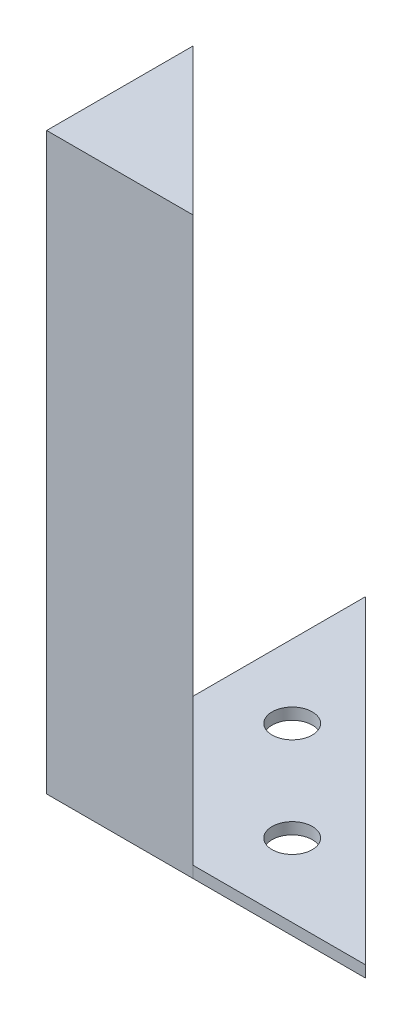
ISO-10303-21;
HEADER;
FILE_DESCRIPTION(('STEP AP214'),'2;1');
FILE_NAME('part.step','',(''),(''),'','','');
FILE_SCHEMA(('AUTOMOTIVE_DESIGN { 1 0 10303 214 1 1 1 1 }'));
ENDSEC;
DATA;
#1=APPLICATION_CONTEXT('core data for automotive mechanical design processes');
#2=APPLICATION_PROTOCOL_DEFINITION('international standard','automotive_design',2000,#1);
#3=PRODUCT_CONTEXT('',#1,'mechanical');
#4=PRODUCT('Part','Part','',(#3));
#5=PRODUCT_RELATED_PRODUCT_CATEGORY('part','',(#4));
#6=PRODUCT_DEFINITION_FORMATION('','',#4);
#7=PRODUCT_DEFINITION_CONTEXT('part definition',#1,'design');
#8=PRODUCT_DEFINITION('design','',#6,#7);
#9=PRODUCT_DEFINITION_SHAPE('','',#8);
#10=(LENGTH_UNIT() NAMED_UNIT(*) SI_UNIT(.MILLI.,.METRE.));
#11=(NAMED_UNIT(*) PLANE_ANGLE_UNIT() SI_UNIT($,.RADIAN.));
#12=(NAMED_UNIT(*) SI_UNIT($,.STERADIAN.) SOLID_ANGLE_UNIT());
#13=UNCERTAINTY_MEASURE_WITH_UNIT(LENGTH_MEASURE(1.E-05),#10,'distance_accuracy_value','');
#14=(GEOMETRIC_REPRESENTATION_CONTEXT(3) GLOBAL_UNCERTAINTY_ASSIGNED_CONTEXT((#13)) GLOBAL_UNIT_ASSIGNED_CONTEXT((#10,
#11,#12)) REPRESENTATION_CONTEXT('',''));
#15=CARTESIAN_POINT('',(0.,0.,0.));
#16=DIRECTION('',(0.,0.,1.));
#17=DIRECTION('',(1.,0.,0.));
#18=AXIS2_PLACEMENT_3D('',#15,#16,#17);
#19=CARTESIAN_POINT('',(12.7279220613579,1.,0.));
#20=DIRECTION('',(-0.707106781186547,0.,0.707106781186547));
#21=DIRECTION('',(0.707106781186548,0.,0.707106781186548));
#22=AXIS2_PLACEMENT_3D('',#19,#20,#21);
#23=PLANE('',#22);
#24=DIRECTION('',(-0.707106781186547,0.,-0.707106781186547));
#25=VECTOR('',#24,1.);
#26=CARTESIAN_POINT('',(12.7279220613579,0.,0.));
#27=LINE('',#26,#25);
#28=CARTESIAN_POINT('',(12.7279220613579,0.,0.));
#29=VERTEX_POINT('',#28);
#30=CARTESIAN_POINT('',(0.,0.,-12.7279220613579));
#31=VERTEX_POINT('',#30);
#32=EDGE_CURVE('E113',#29,#31,#27,.T.);
#33=ORIENTED_EDGE('',*,*,#32,.F.);
#34=DIRECTION('',(0.,-1.,0.));
#35=VECTOR('',#34,1.);
#36=CARTESIAN_POINT('',(12.7279220613579,1.,0.));
#37=LINE('',#36,#35);
#38=CARTESIAN_POINT('',(12.7279220613579,1.,0.));
#39=VERTEX_POINT('',#38);
#40=EDGE_CURVE('E12',#39,#29,#37,.T.);
#41=ORIENTED_EDGE('',*,*,#40,.F.);
#42=DIRECTION('',(-0.707106781186547,0.,-0.707106781186547));
#43=VECTOR('',#42,1.);
#44=CARTESIAN_POINT('',(12.7279220613579,1.,0.));
#45=LINE('',#44,#43);
#46=CARTESIAN_POINT('',(0.,1.,-12.7279220613579));
#47=VERTEX_POINT('',#46);
#48=EDGE_CURVE('E106',#39,#47,#45,.T.);
#49=ORIENTED_EDGE('',*,*,#48,.T.);
#50=DIRECTION('',(0.,-1.,0.));
#51=VECTOR('',#50,1.);
#52=CARTESIAN_POINT('',(0.,1.,-12.7279220613579));
#53=LINE('',#52,#51);
#54=EDGE_CURVE('E51',#47,#31,#53,.T.);
#55=ORIENTED_EDGE('',*,*,#54,.T.);
#56=EDGE_LOOP('',(#33,#41,#49,#55));
#57=FACE_BOUND('',#56,.T.);
#58=ADVANCED_FACE('F48',(#57),#23,.T.);
#59=CARTESIAN_POINT('',(27.7279220613579,1.,0.));
#60=DIRECTION('',(0.,0.,1.));
#61=DIRECTION('',(1.,0.,0.));
#62=AXIS2_PLACEMENT_3D('',#59,#60,#61);
#63=PLANE('',#62);
#64=DIRECTION('',(-1.,0.,0.));
#65=VECTOR('',#64,1.);
#66=CARTESIAN_POINT('',(27.7279220613579,0.,0.));
#67=LINE('',#66,#65);
#68=CARTESIAN_POINT('',(27.7279220613579,0.,0.));
#69=VERTEX_POINT('',#68);
#70=EDGE_CURVE('E108',#69,#29,#67,.T.);
#71=ORIENTED_EDGE('',*,*,#70,.F.);
#72=DIRECTION('',(0.,-1.,0.));
#73=VECTOR('',#72,1.);
#74=CARTESIAN_POINT('',(27.7279220613579,1.,0.));
#75=LINE('',#74,#73);
#76=CARTESIAN_POINT('',(27.7279220613579,1.,0.));
#77=VERTEX_POINT('',#76);
#78=EDGE_CURVE('E57',#77,#69,#75,.T.);
#79=ORIENTED_EDGE('',*,*,#78,.F.);
#80=DIRECTION('',(-1.,0.,0.));
#81=VECTOR('',#80,1.);
#82=CARTESIAN_POINT('',(27.7279220613579,1.,0.));
#83=LINE('',#82,#81);
#84=EDGE_CURVE('E103',#77,#39,#83,.T.);
#85=ORIENTED_EDGE('',*,*,#84,.T.);
#86=ORIENTED_EDGE('',*,*,#40,.T.);
#87=EDGE_LOOP('',(#71,#79,#85,#86));
#88=FACE_BOUND('',#87,.T.);
#89=ADVANCED_FACE('F124',(#88),#63,.T.);
#90=CARTESIAN_POINT('',(0.,1.,-27.7279220613579));
#91=DIRECTION('',(0.707106781186547,0.,-0.707106781186547));
#92=DIRECTION('',(-0.707106781186548,0.,-0.707106781186548));
#93=AXIS2_PLACEMENT_3D('',#90,#91,#92);
#94=PLANE('',#93);
#95=DIRECTION('',(0.707106781186547,0.,0.707106781186547));
#96=VECTOR('',#95,1.);
#97=CARTESIAN_POINT('',(0.,0.,-27.7279220613579));
#98=LINE('',#97,#96);
#99=CARTESIAN_POINT('',(0.,0.,-27.7279220613579));
#100=VERTEX_POINT('',#99);
#101=EDGE_CURVE('E98',#100,#69,#98,.T.);
#102=ORIENTED_EDGE('',*,*,#101,.F.);
#103=DIRECTION('',(0.,-1.,0.));
#104=VECTOR('',#103,1.);
#105=CARTESIAN_POINT('',(0.,1.,-27.7279220613579));
#106=LINE('',#105,#104);
#107=CARTESIAN_POINT('',(0.,1.,-27.7279220613579));
#108=VERTEX_POINT('',#107);
#109=EDGE_CURVE('E93',#108,#100,#106,.T.);
#110=ORIENTED_EDGE('',*,*,#109,.F.);
#111=DIRECTION('',(0.707106781186547,0.,0.707106781186547));
#112=VECTOR('',#111,1.);
#113=CARTESIAN_POINT('',(0.,1.,-27.7279220613579));
#114=LINE('',#113,#112);
#115=EDGE_CURVE('E96',#108,#77,#114,.T.);
#116=ORIENTED_EDGE('',*,*,#115,.T.);
#117=ORIENTED_EDGE('',*,*,#78,.T.);
#118=EDGE_LOOP('',(#102,#110,#116,#117));
#119=FACE_BOUND('',#118,.T.);
#120=ADVANCED_FACE('F95',(#119),#94,.T.);
#121=CARTESIAN_POINT('',(0.,1.,-12.7279220613579));
#122=DIRECTION('',(-1.,0.,0.));
#123=DIRECTION('',(0.,0.,1.));
#124=AXIS2_PLACEMENT_3D('',#121,#122,#123);
#125=PLANE('',#124);
#126=DIRECTION('',(0.,0.,-1.));
#127=VECTOR('',#126,1.);
#128=CARTESIAN_POINT('',(0.,0.,-12.7279220613579));
#129=LINE('',#128,#127);
#130=EDGE_CURVE('E116',#31,#100,#129,.T.);
#131=ORIENTED_EDGE('',*,*,#130,.F.);
#132=ORIENTED_EDGE('',*,*,#54,.F.);
#133=DIRECTION('',(0.,0.,-1.));
#134=VECTOR('',#133,1.);
#135=CARTESIAN_POINT('',(0.,1.,-12.7279220613579));
#136=LINE('',#135,#134);
#137=EDGE_CURVE('E102',#47,#108,#136,.T.);
#138=ORIENTED_EDGE('',*,*,#137,.T.);
#139=ORIENTED_EDGE('',*,*,#109,.T.);
#140=EDGE_LOOP('',(#131,#132,#138,#139));
#141=FACE_BOUND('',#140,.T.);
#142=ADVANCED_FACE('F105',(#141),#125,.T.);
#143=CARTESIAN_POINT('',(0.,1.,0.));
#144=DIRECTION('',(0.,-1.,0.));
#145=DIRECTION('',(0.,0.,-1.));
#146=AXIS2_PLACEMENT_3D('',#143,#144,#145);
#147=PLANE('',#146);
#148=CARTESIAN_POINT('',(15.,1.,-6.36396103067893));
#149=DIRECTION('',(0.,-1.,0.));
#150=DIRECTION('',(0.,0.,-1.));
#151=AXIS2_PLACEMENT_3D('',#148,#149,#150);
#152=CIRCLE('',#151,1.75);
#153=CARTESIAN_POINT('',(15.,1.,-8.11396103067893));
#154=VERTEX_POINT('',#153);
#155=EDGE_CURVE('E117',#154,#154,#152,.T.);
#156=ORIENTED_EDGE('',*,*,#155,.T.);
#157=EDGE_LOOP('',(#156));
#158=FACE_BOUND('',#157,.T.);
#159=CARTESIAN_POINT('',(6.36396103067893,1.,-15.));
#160=DIRECTION('',(0.,-1.,0.));
#161=DIRECTION('',(0.,0.,-1.));
#162=AXIS2_PLACEMENT_3D('',#159,#160,#161);
#163=CIRCLE('',#162,1.75);
#164=CARTESIAN_POINT('',(6.36396103067893,1.,-16.75));
#165=VERTEX_POINT('',#164);
#166=EDGE_CURVE('E160',#165,#165,#163,.T.);
#167=ORIENTED_EDGE('',*,*,#166,.T.);
#168=EDGE_LOOP('',(#167));
#169=FACE_BOUND('',#168,.T.);
#170=ORIENTED_EDGE('',*,*,#48,.F.);
#171=ORIENTED_EDGE('',*,*,#84,.F.);
#172=ORIENTED_EDGE('',*,*,#115,.F.);
#173=ORIENTED_EDGE('',*,*,#137,.F.);
#174=EDGE_LOOP('',(#170,#171,#172,#173));
#175=FACE_BOUND('',#174,.T.);
#176=ADVANCED_FACE('F101',(#158,#169,#175),#147,.F.);
#177=CARTESIAN_POINT('',(0.,0.,0.));
#178=DIRECTION('',(0.,-1.,0.));
#179=DIRECTION('',(0.,0.,-1.));
#180=AXIS2_PLACEMENT_3D('',#177,#178,#179);
#181=PLANE('',#180);
#182=CARTESIAN_POINT('',(15.,0.,-6.36396103067893));
#183=DIRECTION('',(0.,-1.,0.));
#184=DIRECTION('',(0.,0.,-1.));
#185=AXIS2_PLACEMENT_3D('',#182,#183,#184);
#186=CIRCLE('',#185,1.75);
#187=CARTESIAN_POINT('',(15.,0.,-8.11396103067893));
#188=VERTEX_POINT('',#187);
#189=EDGE_CURVE('E159',#188,#188,#186,.T.);
#190=ORIENTED_EDGE('',*,*,#189,.F.);
#191=EDGE_LOOP('',(#190));
#192=FACE_BOUND('',#191,.T.);
#193=CARTESIAN_POINT('',(6.36396103067893,0.,-15.));
#194=DIRECTION('',(0.,-1.,0.));
#195=DIRECTION('',(0.,0.,-1.));
#196=AXIS2_PLACEMENT_3D('',#193,#194,#195);
#197=CIRCLE('',#196,1.75);
#198=CARTESIAN_POINT('',(6.36396103067893,0.,-16.75));
#199=VERTEX_POINT('',#198);
#200=EDGE_CURVE('E164',#199,#199,#197,.T.);
#201=ORIENTED_EDGE('',*,*,#200,.F.);
#202=EDGE_LOOP('',(#201));
#203=FACE_BOUND('',#202,.T.);
#204=ORIENTED_EDGE('',*,*,#32,.T.);
#205=ORIENTED_EDGE('',*,*,#130,.T.);
#206=ORIENTED_EDGE('',*,*,#101,.T.);
#207=ORIENTED_EDGE('',*,*,#70,.T.);
#208=EDGE_LOOP('',(#204,#205,#206,#207));
#209=FACE_BOUND('',#208,.T.);
#210=ADVANCED_FACE('F123',(#192,#203,#209),#181,.T.);
#211=CARTESIAN_POINT('',(6.36396103067893,1.,-15.));
#212=DIRECTION('',(0.,-1.,0.));
#213=DIRECTION('',(0.,0.,-1.));
#214=AXIS2_PLACEMENT_3D('',#211,#212,#213);
#215=CYLINDRICAL_SURFACE('',#214,1.75);
#216=ORIENTED_EDGE('',*,*,#166,.F.);
#217=EDGE_LOOP('',(#216));
#218=FACE_BOUND('',#217,.T.);
#219=ORIENTED_EDGE('',*,*,#200,.T.);
#220=EDGE_LOOP('',(#219));
#221=FACE_BOUND('',#220,.T.);
#222=ADVANCED_FACE('F142',(#218,#221),#215,.F.);
#223=CARTESIAN_POINT('',(15.,1.,-6.36396103067893));
#224=DIRECTION('',(0.,-1.,0.));
#225=DIRECTION('',(0.,0.,-1.));
#226=AXIS2_PLACEMENT_3D('',#223,#224,#225);
#227=CYLINDRICAL_SURFACE('',#226,1.75);
#228=ORIENTED_EDGE('',*,*,#155,.F.);
#229=EDGE_LOOP('',(#228));
#230=FACE_BOUND('',#229,.T.);
#231=ORIENTED_EDGE('',*,*,#189,.T.);
#232=EDGE_LOOP('',(#231));
#233=FACE_BOUND('',#232,.T.);
#234=ADVANCED_FACE('F149',(#230,#233),#227,.F.);
#235=CLOSED_SHELL('',(#58,#89,#120,#142,#176,#210,#222,#234));
#236=MANIFOLD_SOLID_BREP('B2',#235);
#237=CARTESIAN_POINT('',(0.,0.,0.));
#238=DIRECTION('',(0.,-1.,0.));
#239=DIRECTION('',(0.,0.,-1.));
#240=AXIS2_PLACEMENT_3D('',#237,#238,#239);
#241=PLANE('',#240);
#242=DIRECTION('',(0.,0.,1.));
#243=VECTOR('',#242,1.);
#244=CARTESIAN_POINT('',(0.,0.,0.));
#245=LINE('',#244,#243);
#246=CARTESIAN_POINT('',(0.,0.,-12.7279220613579));
#247=VERTEX_POINT('',#246);
#248=CARTESIAN_POINT('',(0.,0.,0.));
#249=VERTEX_POINT('',#248);
#250=EDGE_CURVE('E344',#247,#249,#245,.T.);
#251=ORIENTED_EDGE('',*,*,#250,.F.);
#252=DIRECTION('',(-0.707106781186547,0.,-0.707106781186547));
#253=VECTOR('',#252,1.);
#254=CARTESIAN_POINT('',(0.,0.,-12.7279220613579));
#255=LINE('',#254,#253);
#256=CARTESIAN_POINT('',(12.7279220613579,0.,0.));
#257=VERTEX_POINT('',#256);
#258=EDGE_CURVE('E378',#257,#247,#255,.T.);
#259=ORIENTED_EDGE('',*,*,#258,.F.);
#260=DIRECTION('',(1.,0.,0.));
#261=VECTOR('',#260,1.);
#262=CARTESIAN_POINT('',(0.,0.,0.));
#263=LINE('',#262,#261);
#264=EDGE_CURVE('E388',#249,#257,#263,.T.);
#265=ORIENTED_EDGE('',*,*,#264,.F.);
#266=EDGE_LOOP('',(#251,#259,#265));
#267=FACE_BOUND('',#266,.T.);
#268=DIRECTION('',(-0.707106781186548,0.,-0.707106781186548));
#269=VECTOR('',#268,1.);
#270=CARTESIAN_POINT('',(4.94974746830583,0.,-4.94974746830583));
#271=LINE('',#270,#269);
#272=CARTESIAN_POINT('',(7.89949493661166,0.,-2.));
#273=VERTEX_POINT('',#272);
#274=CARTESIAN_POINT('',(2.,0.,-7.89949493661166));
#275=VERTEX_POINT('',#274);
#276=EDGE_CURVE('E351',#273,#275,#271,.T.);
#277=ORIENTED_EDGE('',*,*,#276,.T.);
#278=DIRECTION('',(0.,0.,1.));
#279=VECTOR('',#278,1.);
#280=CARTESIAN_POINT('',(2.,0.,0.));
#281=LINE('',#280,#279);
#282=CARTESIAN_POINT('',(2.,0.,-2.));
#283=VERTEX_POINT('',#282);
#284=EDGE_CURVE('E334',#275,#283,#281,.T.);
#285=ORIENTED_EDGE('',*,*,#284,.T.);
#286=DIRECTION('',(1.,0.,0.));
#287=VECTOR('',#286,1.);
#288=CARTESIAN_POINT('',(0.,0.,-2.));
#289=LINE('',#288,#287);
#290=EDGE_CURVE('E366',#283,#273,#289,.T.);
#291=ORIENTED_EDGE('',*,*,#290,.T.);
#292=EDGE_LOOP('',(#277,#285,#291));
#293=FACE_BOUND('',#292,.T.);
#294=ADVANCED_FACE('F213',(#267,#293),#241,.T.);
#295=CARTESIAN_POINT('',(0.,50.,0.));
#296=DIRECTION('',(1.,0.,0.));
#297=DIRECTION('',(0.,0.,-1.));
#298=AXIS2_PLACEMENT_3D('',#295,#296,#297);
#299=PLANE('',#298);
#300=ORIENTED_EDGE('',*,*,#250,.T.);
#301=DIRECTION('',(0.,-1.,0.));
#302=VECTOR('',#301,1.);
#303=CARTESIAN_POINT('',(0.,50.,0.));
#304=LINE('',#303,#302);
#305=CARTESIAN_POINT('',(0.,50.,0.));
#306=VERTEX_POINT('',#305);
#307=EDGE_CURVE('E46',#306,#249,#304,.T.);
#308=ORIENTED_EDGE('',*,*,#307,.F.);
#309=DIRECTION('',(0.,0.,1.));
#310=VECTOR('',#309,1.);
#311=CARTESIAN_POINT('',(0.,50.,0.));
#312=LINE('',#311,#310);
#313=CARTESIAN_POINT('',(0.,50.,-12.7279220613579));
#314=VERTEX_POINT('',#313);
#315=EDGE_CURVE('E373',#314,#306,#312,.T.);
#316=ORIENTED_EDGE('',*,*,#315,.F.);
#317=DIRECTION('',(0.,-1.,0.));
#318=VECTOR('',#317,1.);
#319=CARTESIAN_POINT('',(0.,50.,-12.7279220613579));
#320=LINE('',#319,#318);
#321=EDGE_CURVE('E384',#314,#247,#320,.T.);
#322=ORIENTED_EDGE('',*,*,#321,.T.);
#323=EDGE_LOOP('',(#300,#308,#316,#322));
#324=FACE_BOUND('',#323,.T.);
#325=ADVANCED_FACE('F215',(#324),#299,.F.);
#326=CARTESIAN_POINT('',(0.,50.,0.));
#327=DIRECTION('',(0.,0.,-1.));
#328=DIRECTION('',(-1.,0.,0.));
#329=AXIS2_PLACEMENT_3D('',#326,#327,#328);
#330=PLANE('',#329);
#331=ORIENTED_EDGE('',*,*,#264,.T.);
#332=DIRECTION('',(0.,-1.,0.));
#333=VECTOR('',#332,1.);
#334=CARTESIAN_POINT('',(12.7279220613579,50.,0.));
#335=LINE('',#334,#333);
#336=CARTESIAN_POINT('',(12.7279220613579,50.,0.));
#337=VERTEX_POINT('',#336);
#338=EDGE_CURVE('E222',#337,#257,#335,.T.);
#339=ORIENTED_EDGE('',*,*,#338,.F.);
#340=DIRECTION('',(1.,0.,0.));
#341=VECTOR('',#340,1.);
#342=CARTESIAN_POINT('',(0.,50.,0.));
#343=LINE('',#342,#341);
#344=EDGE_CURVE('E377',#306,#337,#343,.T.);
#345=ORIENTED_EDGE('',*,*,#344,.F.);
#346=ORIENTED_EDGE('',*,*,#307,.T.);
#347=EDGE_LOOP('',(#331,#339,#345,#346));
#348=FACE_BOUND('',#347,.T.);
#349=ADVANCED_FACE('F412',(#348),#330,.F.);
#350=CARTESIAN_POINT('',(0.,50.,-12.7279220613579));
#351=DIRECTION('',(-0.707106781186547,0.,0.707106781186547));
#352=DIRECTION('',(0.707106781186548,0.,0.707106781186548));
#353=AXIS2_PLACEMENT_3D('',#350,#351,#352);
#354=PLANE('',#353);
#355=DIRECTION('',(-0.707106781186547,0.,-0.707106781186548));
#356=VECTOR('',#355,1.);
#357=CARTESIAN_POINT('',(8.48302641991124,41.5,-4.24489564144662));
#358=LINE('',#357,#356);
#359=CARTESIAN_POINT('',(8.48302641991124,41.5,-4.24489564144661));
#360=VERTEX_POINT('',#359);
#361=CARTESIAN_POINT('',(4.24264068711929,41.5,-8.48528137423857));
#362=VERTEX_POINT('',#361);
#363=EDGE_CURVE('E325',#360,#362,#358,.T.);
#364=ORIENTED_EDGE('',*,*,#363,.F.);
#365=CARTESIAN_POINT('',(8.48302641991124,42.,-4.24489564144662));
#366=DIRECTION('',(0.707106781186548,0.,-0.707106781186547));
#367=DIRECTION('',(-0.707106781186547,0.,-0.707106781186548));
#368=AXIS2_PLACEMENT_3D('',#365,#366,#367);
#369=CIRCLE('',#368,0.5);
#370=CARTESIAN_POINT('',(8.48302641991124,42.5,-4.24489564144662));
#371=VERTEX_POINT('',#370);
#372=EDGE_CURVE('E229',#371,#360,#369,.T.);
#373=ORIENTED_EDGE('',*,*,#372,.F.);
#374=DIRECTION('',(0.707106781186547,0.,0.707106781186548));
#375=VECTOR('',#374,1.);
#376=CARTESIAN_POINT('',(8.48302641991124,42.5,-4.24489564144662));
#377=LINE('',#376,#375);
#378=CARTESIAN_POINT('',(4.24264068711929,42.5,-8.48528137423857));
#379=VERTEX_POINT('',#378);
#380=EDGE_CURVE('E312',#379,#371,#377,.T.);
#381=ORIENTED_EDGE('',*,*,#380,.F.);
#382=CARTESIAN_POINT('',(4.24264068711929,42.,-8.48528137423857));
#383=DIRECTION('',(0.707106781186548,0.,-0.707106781186547));
#384=DIRECTION('',(-0.707106781186547,0.,-0.707106781186548));
#385=AXIS2_PLACEMENT_3D('',#382,#383,#384);
#386=CIRCLE('',#385,0.5);
#387=EDGE_CURVE('E316',#362,#379,#386,.T.);
#388=ORIENTED_EDGE('',*,*,#387,.F.);
#389=EDGE_LOOP('',(#364,#373,#381,#388));
#390=FACE_BOUND('',#389,.T.);
#391=ORIENTED_EDGE('',*,*,#258,.T.);
#392=ORIENTED_EDGE('',*,*,#321,.F.);
#393=DIRECTION('',(-0.707106781186547,0.,-0.707106781186547));
#394=VECTOR('',#393,1.);
#395=CARTESIAN_POINT('',(0.,50.,-12.7279220613579));
#396=LINE('',#395,#394);
#397=EDGE_CURVE('E381',#337,#314,#396,.T.);
#398=ORIENTED_EDGE('',*,*,#397,.F.);
#399=ORIENTED_EDGE('',*,*,#338,.T.);
#400=EDGE_LOOP('',(#391,#392,#398,#399));
#401=FACE_BOUND('',#400,.T.);
#402=ADVANCED_FACE('F401',(#390,#401),#354,.F.);
#403=CARTESIAN_POINT('',(0.,50.,0.));
#404=DIRECTION('',(0.,-1.,0.));
#405=DIRECTION('',(0.,0.,-1.));
#406=AXIS2_PLACEMENT_3D('',#403,#404,#405);
#407=PLANE('',#406);
#408=ORIENTED_EDGE('',*,*,#315,.T.);
#409=ORIENTED_EDGE('',*,*,#344,.T.);
#410=ORIENTED_EDGE('',*,*,#397,.T.);
#411=EDGE_LOOP('',(#408,#409,#410));
#412=FACE_BOUND('',#411,.T.);
#413=ADVANCED_FACE('F411',(#412),#407,.F.);
#414=CARTESIAN_POINT('',(2.,50.,0.));
#415=DIRECTION('',(1.,0.,0.));
#416=DIRECTION('',(0.,0.,-1.));
#417=AXIS2_PLACEMENT_3D('',#414,#415,#416);
#418=PLANE('',#417);
#419=ORIENTED_EDGE('',*,*,#284,.F.);
#420=DIRECTION('',(0.,-1.,0.));
#421=VECTOR('',#420,1.);
#422=CARTESIAN_POINT('',(2.,50.,-7.89949493661167));
#423=LINE('',#422,#421);
#424=CARTESIAN_POINT('',(2.,48.,-7.89949493661166));
#425=VERTEX_POINT('',#424);
#426=EDGE_CURVE('E352',#425,#275,#423,.T.);
#427=ORIENTED_EDGE('',*,*,#426,.F.);
#428=DIRECTION('',(0.,0.,1.));
#429=VECTOR('',#428,1.);
#430=CARTESIAN_POINT('',(2.,48.,0.));
#431=LINE('',#430,#429);
#432=CARTESIAN_POINT('',(2.,48.,-2.));
#433=VERTEX_POINT('',#432);
#434=EDGE_CURVE('E346',#425,#433,#431,.T.);
#435=ORIENTED_EDGE('',*,*,#434,.T.);
#436=DIRECTION('',(0.,-1.,0.));
#437=VECTOR('',#436,1.);
#438=CARTESIAN_POINT('',(2.,50.,-2.));
#439=LINE('',#438,#437);
#440=EDGE_CURVE('E340',#433,#283,#439,.T.);
#441=ORIENTED_EDGE('',*,*,#440,.T.);
#442=EDGE_LOOP('',(#419,#427,#435,#441));
#443=FACE_BOUND('',#442,.T.);
#444=ADVANCED_FACE('F430',(#443),#418,.T.);
#445=CARTESIAN_POINT('',(0.,50.,-2.));
#446=DIRECTION('',(0.,0.,-1.));
#447=DIRECTION('',(-1.,0.,0.));
#448=AXIS2_PLACEMENT_3D('',#445,#446,#447);
#449=PLANE('',#448);
#450=ORIENTED_EDGE('',*,*,#290,.F.);
#451=ORIENTED_EDGE('',*,*,#440,.F.);
#452=DIRECTION('',(1.,0.,0.));
#453=VECTOR('',#452,1.);
#454=CARTESIAN_POINT('',(0.,48.,-2.));
#455=LINE('',#454,#453);
#456=CARTESIAN_POINT('',(7.89949493661166,48.,-2.));
#457=VERTEX_POINT('',#456);
#458=EDGE_CURVE('E350',#433,#457,#455,.T.);
#459=ORIENTED_EDGE('',*,*,#458,.T.);
#460=DIRECTION('',(0.,-1.,0.));
#461=VECTOR('',#460,1.);
#462=CARTESIAN_POINT('',(7.89949493661166,50.,-2.));
#463=LINE('',#462,#461);
#464=EDGE_CURVE('E345',#457,#273,#463,.T.);
#465=ORIENTED_EDGE('',*,*,#464,.T.);
#466=EDGE_LOOP('',(#450,#451,#459,#465));
#467=FACE_BOUND('',#466,.T.);
#468=ADVANCED_FACE('F437',(#467),#449,.T.);
#469=CARTESIAN_POINT('',(-1.41421356237309,50.,-11.3137084989848));
#470=DIRECTION('',(-0.707106781186547,0.,0.707106781186547));
#471=DIRECTION('',(0.707106781186548,0.,0.707106781186548));
#472=AXIS2_PLACEMENT_3D('',#469,#470,#471);
#473=PLANE('',#472);
#474=CARTESIAN_POINT('',(7.06881285753815,42.,-2.83068207907352));
#475=DIRECTION('',(0.707106781186548,0.,-0.707106781186547));
#476=DIRECTION('',(-0.707106781186547,0.,-0.707106781186548));
#477=AXIS2_PLACEMENT_3D('',#474,#475,#476);
#478=CIRCLE('',#477,0.5);
#479=CARTESIAN_POINT('',(7.06881285753815,42.5,-2.83068207907352));
#480=VERTEX_POINT('',#479);
#481=CARTESIAN_POINT('',(7.06881285753815,41.5,-2.83068207907352));
#482=VERTEX_POINT('',#481);
#483=EDGE_CURVE('E293',#480,#482,#478,.T.);
#484=ORIENTED_EDGE('',*,*,#483,.T.);
#485=DIRECTION('',(-0.707106781186547,0.,-0.707106781186548));
#486=VECTOR('',#485,1.);
#487=CARTESIAN_POINT('',(7.06881285753815,41.5,-2.83068207907352));
#488=LINE('',#487,#486);
#489=CARTESIAN_POINT('',(2.82842712474619,41.5,-7.07106781186547));
#490=VERTEX_POINT('',#489);
#491=EDGE_CURVE('E303',#482,#490,#488,.T.);
#492=ORIENTED_EDGE('',*,*,#491,.T.);
#493=CARTESIAN_POINT('',(2.82842712474619,42.,-7.07106781186548));
#494=DIRECTION('',(0.707106781186548,0.,-0.707106781186547));
#495=DIRECTION('',(-0.707106781186547,0.,-0.707106781186548));
#496=AXIS2_PLACEMENT_3D('',#493,#494,#495);
#497=CIRCLE('',#496,0.5);
#498=CARTESIAN_POINT('',(2.82842712474619,42.5,-7.07106781186548));
#499=VERTEX_POINT('',#498);
#500=EDGE_CURVE('E237',#490,#499,#497,.T.);
#501=ORIENTED_EDGE('',*,*,#500,.T.);
#502=DIRECTION('',(0.707106781186547,0.,0.707106781186548));
#503=VECTOR('',#502,1.);
#504=CARTESIAN_POINT('',(7.06881285753815,42.5,-2.83068207907352));
#505=LINE('',#504,#503);
#506=EDGE_CURVE('E300',#499,#480,#505,.T.);
#507=ORIENTED_EDGE('',*,*,#506,.T.);
#508=EDGE_LOOP('',(#484,#492,#501,#507));
#509=FACE_BOUND('',#508,.T.);
#510=ORIENTED_EDGE('',*,*,#276,.F.);
#511=ORIENTED_EDGE('',*,*,#464,.F.);
#512=DIRECTION('',(-0.707106781186548,0.,-0.707106781186548));
#513=VECTOR('',#512,1.);
#514=CARTESIAN_POINT('',(4.94974746830583,48.,-4.94974746830583));
#515=LINE('',#514,#513);
#516=EDGE_CURVE('E355',#457,#425,#515,.T.);
#517=ORIENTED_EDGE('',*,*,#516,.T.);
#518=ORIENTED_EDGE('',*,*,#426,.T.);
#519=EDGE_LOOP('',(#510,#511,#517,#518));
#520=FACE_BOUND('',#519,.T.);
#521=ADVANCED_FACE('F308',(#509,#520),#473,.T.);
#522=CARTESIAN_POINT('',(0.,48.,0.));
#523=DIRECTION('',(0.,-1.,0.));
#524=DIRECTION('',(0.,0.,-1.));
#525=AXIS2_PLACEMENT_3D('',#522,#523,#524);
#526=PLANE('',#525);
#527=ORIENTED_EDGE('',*,*,#434,.F.);
#528=ORIENTED_EDGE('',*,*,#516,.F.);
#529=ORIENTED_EDGE('',*,*,#458,.F.);
#530=EDGE_LOOP('',(#527,#528,#529));
#531=FACE_BOUND('',#530,.T.);
#532=ADVANCED_FACE('F431',(#531),#526,.T.);
#533=CARTESIAN_POINT('',(7.06881285753815,42.,-2.83068207907352));
#534=DIRECTION('',(0.707106781186548,0.,-0.707106781186547));
#535=DIRECTION('',(-0.707106781186547,0.,-0.707106781186548));
#536=AXIS2_PLACEMENT_3D('',#533,#534,#535);
#537=CYLINDRICAL_SURFACE('',#536,0.5);
#538=ORIENTED_EDGE('',*,*,#372,.T.);
#539=DIRECTION('',(0.707106781186548,0.,-0.707106781186547));
#540=VECTOR('',#539,1.);
#541=CARTESIAN_POINT('',(7.06881285753815,41.5,-2.83068207907352));
#542=LINE('',#541,#540);
#543=EDGE_CURVE('E289',#482,#360,#542,.T.);
#544=ORIENTED_EDGE('',*,*,#543,.F.);
#545=ORIENTED_EDGE('',*,*,#483,.F.);
#546=DIRECTION('',(0.707106781186548,0.,-0.707106781186547));
#547=VECTOR('',#546,1.);
#548=CARTESIAN_POINT('',(7.06881285753815,42.5,-2.83068207907352));
#549=LINE('',#548,#547);
#550=EDGE_CURVE('E331',#480,#371,#549,.T.);
#551=ORIENTED_EDGE('',*,*,#550,.T.);
#552=EDGE_LOOP('',(#538,#544,#545,#551));
#553=FACE_BOUND('',#552,.T.);
#554=ADVANCED_FACE('F291',(#553),#537,.F.);
#555=CARTESIAN_POINT('',(7.06881285753815,42.5,-2.83068207907352));
#556=DIRECTION('',(0.,1.,0.));
#557=DIRECTION('',(0.,0.,1.));
#558=AXIS2_PLACEMENT_3D('',#555,#556,#557);
#559=PLANE('',#558);
#560=ORIENTED_EDGE('',*,*,#380,.T.);
#561=ORIENTED_EDGE('',*,*,#550,.F.);
#562=ORIENTED_EDGE('',*,*,#506,.F.);
#563=DIRECTION('',(0.707106781186548,0.,-0.707106781186547));
#564=VECTOR('',#563,1.);
#565=CARTESIAN_POINT('',(2.82842712474619,42.5,-7.07106781186548));
#566=LINE('',#565,#564);
#567=EDGE_CURVE('E335',#499,#379,#566,.T.);
#568=ORIENTED_EDGE('',*,*,#567,.T.);
#569=EDGE_LOOP('',(#560,#561,#562,#568));
#570=FACE_BOUND('',#569,.T.);
#571=ADVANCED_FACE('F445',(#570),#559,.F.);
#572=CARTESIAN_POINT('',(2.82842712474619,42.,-7.07106781186548));
#573=DIRECTION('',(0.707106781186548,0.,-0.707106781186547));
#574=DIRECTION('',(-0.707106781186547,0.,-0.707106781186548));
#575=AXIS2_PLACEMENT_3D('',#572,#573,#574);
#576=CYLINDRICAL_SURFACE('',#575,0.5);
#577=ORIENTED_EDGE('',*,*,#387,.T.);
#578=ORIENTED_EDGE('',*,*,#567,.F.);
#579=ORIENTED_EDGE('',*,*,#500,.F.);
#580=DIRECTION('',(0.707106781186548,0.,-0.707106781186547));
#581=VECTOR('',#580,1.);
#582=CARTESIAN_POINT('',(2.82842712474619,41.5,-7.07106781186548));
#583=LINE('',#582,#581);
#584=EDGE_CURVE('E299',#490,#362,#583,.T.);
#585=ORIENTED_EDGE('',*,*,#584,.T.);
#586=EDGE_LOOP('',(#577,#578,#579,#585));
#587=FACE_BOUND('',#586,.T.);
#588=ADVANCED_FACE('F448',(#587),#576,.F.);
#589=CARTESIAN_POINT('',(7.06881285753815,41.5,-2.83068207907352));
#590=DIRECTION('',(0.,-1.,0.));
#591=DIRECTION('',(0.,0.,-1.));
#592=AXIS2_PLACEMENT_3D('',#589,#590,#591);
#593=PLANE('',#592);
#594=ORIENTED_EDGE('',*,*,#363,.T.);
#595=ORIENTED_EDGE('',*,*,#584,.F.);
#596=ORIENTED_EDGE('',*,*,#491,.F.);
#597=ORIENTED_EDGE('',*,*,#543,.T.);
#598=EDGE_LOOP('',(#594,#595,#596,#597));
#599=FACE_BOUND('',#598,.T.);
#600=ADVANCED_FACE('F304',(#599),#593,.F.);
#601=CLOSED_SHELL('',(#294,#325,#349,#402,#413,#444,#468,#521,#532,#554,#571,#588,#600));
#602=MANIFOLD_SOLID_BREP('B6',#601);
#603=ADVANCED_BREP_SHAPE_REPRESENTATION('',(#18,#236,#602),#14);
#604=SHAPE_DEFINITION_REPRESENTATION(#9,#603);
ENDSEC;
END-ISO-10303-21;
